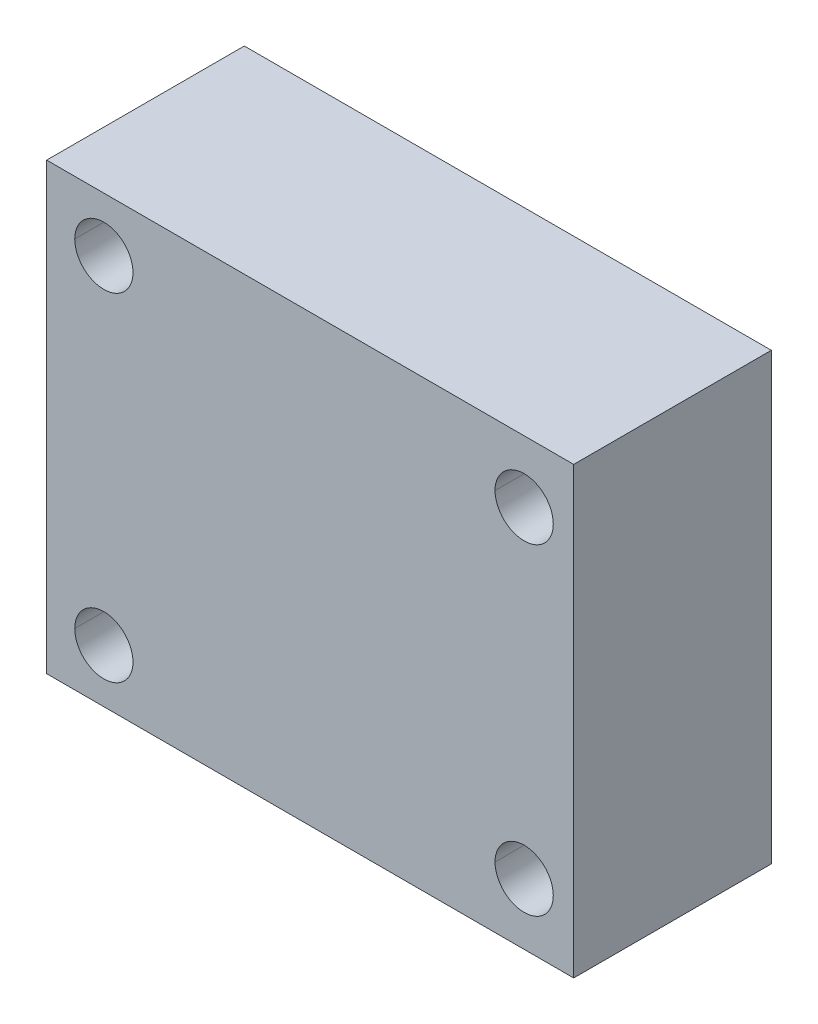
ISO-10303-21;
HEADER;
FILE_DESCRIPTION(('STEP AP214'),'2;1');
FILE_NAME('part.step','',(''),(''),'','','');
FILE_SCHEMA(('AUTOMOTIVE_DESIGN { 1 0 10303 214 1 1 1 1 }'));
ENDSEC;
DATA;
#1=APPLICATION_CONTEXT('core data for automotive mechanical design processes');
#2=APPLICATION_PROTOCOL_DEFINITION('international standard','automotive_design',2000,#1);
#3=PRODUCT_CONTEXT('',#1,'mechanical');
#4=PRODUCT('Part','Part','',(#3));
#5=PRODUCT_RELATED_PRODUCT_CATEGORY('part','',(#4));
#6=PRODUCT_DEFINITION_FORMATION('','',#4);
#7=PRODUCT_DEFINITION_CONTEXT('part definition',#1,'design');
#8=PRODUCT_DEFINITION('design','',#6,#7);
#9=PRODUCT_DEFINITION_SHAPE('','',#8);
#10=(LENGTH_UNIT() NAMED_UNIT(*) SI_UNIT(.MILLI.,.METRE.));
#11=(NAMED_UNIT(*) PLANE_ANGLE_UNIT() SI_UNIT($,.RADIAN.));
#12=(NAMED_UNIT(*) SI_UNIT($,.STERADIAN.) SOLID_ANGLE_UNIT());
#13=UNCERTAINTY_MEASURE_WITH_UNIT(LENGTH_MEASURE(1.E-05),#10,'distance_accuracy_value','');
#14=(GEOMETRIC_REPRESENTATION_CONTEXT(3) GLOBAL_UNCERTAINTY_ASSIGNED_CONTEXT((#13)) GLOBAL_UNIT_ASSIGNED_CONTEXT((#10,
#11,#12)) REPRESENTATION_CONTEXT('',''));
#15=CARTESIAN_POINT('',(0.,0.,0.));
#16=DIRECTION('',(0.,0.,1.));
#17=DIRECTION('',(1.,0.,0.));
#18=AXIS2_PLACEMENT_3D('',#15,#16,#17);
#19=CARTESIAN_POINT('',(111.96564613414,331.44206,19.05));
#20=DIRECTION('',(0.,-1.,0.));
#21=DIRECTION('',(0.,0.,-1.));
#22=AXIS2_PLACEMENT_3D('',#19,#20,#21);
#23=PLANE('',#22);
#24=DIRECTION('',(-1.,0.,0.));
#25=VECTOR('',#24,1.);
#26=CARTESIAN_POINT('',(111.96564613414,331.44206,0.));
#27=LINE('',#26,#25);
#28=CARTESIAN_POINT('',(111.96564613414,331.44206,0.));
#29=VERTEX_POINT('',#28);
#30=CARTESIAN_POINT('',(61.165646134144,331.44206,0.));
#31=VERTEX_POINT('',#30);
#32=EDGE_CURVE('E11',#29,#31,#27,.T.);
#33=ORIENTED_EDGE('',*,*,#32,.T.);
#34=DIRECTION('',(0.,0.,-1.));
#35=VECTOR('',#34,1.);
#36=CARTESIAN_POINT('',(61.165646134144,331.44206,19.05));
#37=LINE('',#36,#35);
#38=CARTESIAN_POINT('',(61.165646134144,331.44206,19.05));
#39=VERTEX_POINT('',#38);
#40=EDGE_CURVE('E25',#39,#31,#37,.T.);
#41=ORIENTED_EDGE('',*,*,#40,.F.);
#42=DIRECTION('',(-1.,0.,0.));
#43=VECTOR('',#42,1.);
#44=CARTESIAN_POINT('',(111.96564613414,331.44206,19.05));
#45=LINE('',#44,#43);
#46=CARTESIAN_POINT('',(111.96564613414,331.44206,19.05));
#47=VERTEX_POINT('',#46);
#48=EDGE_CURVE('E240',#47,#39,#45,.T.);
#49=ORIENTED_EDGE('',*,*,#48,.F.);
#50=DIRECTION('',(0.,0.,-1.));
#51=VECTOR('',#50,1.);
#52=CARTESIAN_POINT('',(111.96564613414,331.44206,19.05));
#53=LINE('',#52,#51);
#54=EDGE_CURVE('E236',#47,#29,#53,.T.);
#55=ORIENTED_EDGE('',*,*,#54,.T.);
#56=EDGE_LOOP('',(#33,#41,#49,#55));
#57=FACE_BOUND('',#56,.T.);
#58=ADVANCED_FACE('F17',(#57),#23,.F.);
#59=CARTESIAN_POINT('',(111.96564613414,288.56686,19.05));
#60=DIRECTION('',(-1.,0.,0.));
#61=DIRECTION('',(0.,0.,1.));
#62=AXIS2_PLACEMENT_3D('',#59,#60,#61);
#63=PLANE('',#62);
#64=DIRECTION('',(0.,1.,0.));
#65=VECTOR('',#64,1.);
#66=CARTESIAN_POINT('',(111.96564613414,288.56686,0.));
#67=LINE('',#66,#65);
#68=CARTESIAN_POINT('',(111.96564613414,288.56686,0.));
#69=VERTEX_POINT('',#68);
#70=EDGE_CURVE('E231',#69,#29,#67,.T.);
#71=ORIENTED_EDGE('',*,*,#70,.T.);
#72=ORIENTED_EDGE('',*,*,#54,.F.);
#73=DIRECTION('',(0.,1.,0.));
#74=VECTOR('',#73,1.);
#75=CARTESIAN_POINT('',(111.96564613414,288.56686,19.05));
#76=LINE('',#75,#74);
#77=CARTESIAN_POINT('',(111.96564613414,288.56686,19.05));
#78=VERTEX_POINT('',#77);
#79=EDGE_CURVE('E226',#78,#47,#76,.T.);
#80=ORIENTED_EDGE('',*,*,#79,.F.);
#81=DIRECTION('',(0.,0.,-1.));
#82=VECTOR('',#81,1.);
#83=CARTESIAN_POINT('',(111.96564613414,288.56686,19.05));
#84=LINE('',#83,#82);
#85=EDGE_CURVE('E222',#78,#69,#84,.T.);
#86=ORIENTED_EDGE('',*,*,#85,.T.);
#87=EDGE_LOOP('',(#71,#72,#80,#86));
#88=FACE_BOUND('',#87,.T.);
#89=ADVANCED_FACE('F263',(#88),#63,.F.);
#90=CARTESIAN_POINT('',(61.165646134144,288.56686,19.05));
#91=DIRECTION('',(0.,1.,0.));
#92=DIRECTION('',(0.,0.,1.));
#93=AXIS2_PLACEMENT_3D('',#90,#91,#92);
#94=PLANE('',#93);
#95=DIRECTION('',(1.,0.,0.));
#96=VECTOR('',#95,1.);
#97=CARTESIAN_POINT('',(61.165646134144,288.56686,0.));
#98=LINE('',#97,#96);
#99=CARTESIAN_POINT('',(61.165646134144,288.56686,0.));
#100=VERTEX_POINT('',#99);
#101=EDGE_CURVE('E217',#100,#69,#98,.T.);
#102=ORIENTED_EDGE('',*,*,#101,.T.);
#103=ORIENTED_EDGE('',*,*,#85,.F.);
#104=DIRECTION('',(1.,0.,0.));
#105=VECTOR('',#104,1.);
#106=CARTESIAN_POINT('',(61.165646134144,288.56686,19.05));
#107=LINE('',#106,#105);
#108=CARTESIAN_POINT('',(61.165646134144,288.56686,19.05));
#109=VERTEX_POINT('',#108);
#110=EDGE_CURVE('E212',#109,#78,#107,.T.);
#111=ORIENTED_EDGE('',*,*,#110,.F.);
#112=DIRECTION('',(0.,0.,-1.));
#113=VECTOR('',#112,1.);
#114=CARTESIAN_POINT('',(61.165646134144,288.56686,19.05));
#115=LINE('',#114,#113);
#116=EDGE_CURVE('E208',#109,#100,#115,.T.);
#117=ORIENTED_EDGE('',*,*,#116,.T.);
#118=EDGE_LOOP('',(#102,#103,#111,#117));
#119=FACE_BOUND('',#118,.T.);
#120=ADVANCED_FACE('F258',(#119),#94,.F.);
#121=CARTESIAN_POINT('',(61.165646134144,331.44206,19.05));
#122=DIRECTION('',(1.,0.,0.));
#123=DIRECTION('',(0.,0.,-1.));
#124=AXIS2_PLACEMENT_3D('',#121,#122,#123);
#125=PLANE('',#124);
#126=DIRECTION('',(0.,-1.,0.));
#127=VECTOR('',#126,1.);
#128=CARTESIAN_POINT('',(61.165646134144,331.44206,0.));
#129=LINE('',#128,#127);
#130=EDGE_CURVE('E203',#31,#100,#129,.T.);
#131=ORIENTED_EDGE('',*,*,#130,.T.);
#132=ORIENTED_EDGE('',*,*,#116,.F.);
#133=DIRECTION('',(0.,-1.,0.));
#134=VECTOR('',#133,1.);
#135=CARTESIAN_POINT('',(61.165646134144,331.44206,19.05));
#136=LINE('',#135,#134);
#137=EDGE_CURVE('E198',#39,#109,#136,.T.);
#138=ORIENTED_EDGE('',*,*,#137,.F.);
#139=ORIENTED_EDGE('',*,*,#40,.T.);
#140=EDGE_LOOP('',(#131,#132,#138,#139));
#141=FACE_BOUND('',#140,.T.);
#142=ADVANCED_FACE('F251',(#141),#125,.F.);
#143=CARTESIAN_POINT('',(0.,0.,19.05));
#144=DIRECTION('',(0.,0.,1.));
#145=DIRECTION('',(1.,0.,0.));
#146=AXIS2_PLACEMENT_3D('',#143,#144,#145);
#147=PLANE('',#146);
#148=CARTESIAN_POINT('',(66.677446134144,293.69766,19.05));
#149=DIRECTION('',(0.,0.,1.));
#150=DIRECTION('',(1.,0.,0.));
#151=AXIS2_PLACEMENT_3D('',#148,#149,#150);
#152=CIRCLE('',#151,2.8067);
#153=CARTESIAN_POINT('',(69.484146134144,293.69766,19.05));
#154=VERTEX_POINT('',#153);
#155=CARTESIAN_POINT('',(63.870746134144,293.69766,19.05));
#156=VERTEX_POINT('',#155);
#157=EDGE_CURVE('E193',#154,#156,#152,.T.);
#158=ORIENTED_EDGE('',*,*,#157,.F.);
#159=CARTESIAN_POINT('',(66.677446134144,293.69766,19.05));
#160=DIRECTION('',(0.,0.,1.));
#161=DIRECTION('',(1.,0.,0.));
#162=AXIS2_PLACEMENT_3D('',#159,#160,#161);
#163=CIRCLE('',#162,2.8067);
#164=EDGE_CURVE('E188',#156,#154,#163,.T.);
#165=ORIENTED_EDGE('',*,*,#164,.F.);
#166=EDGE_LOOP('',(#158,#165));
#167=FACE_BOUND('',#166,.T.);
#168=CARTESIAN_POINT('',(66.677446134144,326.20966,19.05));
#169=DIRECTION('',(0.,0.,1.));
#170=DIRECTION('',(1.,0.,0.));
#171=AXIS2_PLACEMENT_3D('',#168,#169,#170);
#172=CIRCLE('',#171,2.8067);
#173=CARTESIAN_POINT('',(69.484146134144,326.20966,19.05));
#174=VERTEX_POINT('',#173);
#175=CARTESIAN_POINT('',(63.870746134144,326.20966,19.05));
#176=VERTEX_POINT('',#175);
#177=EDGE_CURVE('E183',#174,#176,#172,.T.);
#178=ORIENTED_EDGE('',*,*,#177,.F.);
#179=CARTESIAN_POINT('',(66.677446134144,326.20966,19.05));
#180=DIRECTION('',(0.,0.,1.));
#181=DIRECTION('',(1.,0.,0.));
#182=AXIS2_PLACEMENT_3D('',#179,#180,#181);
#183=CIRCLE('',#182,2.8067);
#184=EDGE_CURVE('E178',#176,#174,#183,.T.);
#185=ORIENTED_EDGE('',*,*,#184,.F.);
#186=EDGE_LOOP('',(#178,#185));
#187=FACE_BOUND('',#186,.T.);
#188=CARTESIAN_POINT('',(107.19044613414,294.45966,19.05));
#189=DIRECTION('',(0.,0.,1.));
#190=DIRECTION('',(1.,0.,0.));
#191=AXIS2_PLACEMENT_3D('',#188,#189,#190);
#192=CIRCLE('',#191,2.8067);
#193=CARTESIAN_POINT('',(109.99714613414,294.45966,19.05));
#194=VERTEX_POINT('',#193);
#195=CARTESIAN_POINT('',(104.38374613414,294.45966,19.05));
#196=VERTEX_POINT('',#195);
#197=EDGE_CURVE('E174',#194,#196,#192,.T.);
#198=ORIENTED_EDGE('',*,*,#197,.F.);
#199=CARTESIAN_POINT('',(107.19044613414,294.45966,19.05));
#200=DIRECTION('',(0.,0.,1.));
#201=DIRECTION('',(1.,0.,0.));
#202=AXIS2_PLACEMENT_3D('',#199,#200,#201);
#203=CIRCLE('',#202,2.8067);
#204=EDGE_CURVE('E115',#196,#194,#203,.T.);
#205=ORIENTED_EDGE('',*,*,#204,.F.);
#206=EDGE_LOOP('',(#198,#205));
#207=FACE_BOUND('',#206,.T.);
#208=CARTESIAN_POINT('',(107.19044613414,325.47306,19.05));
#209=DIRECTION('',(0.,0.,1.));
#210=DIRECTION('',(1.,0.,0.));
#211=AXIS2_PLACEMENT_3D('',#208,#209,#210);
#212=CIRCLE('',#211,2.8067);
#213=CARTESIAN_POINT('',(109.99714613414,325.47306,19.05));
#214=VERTEX_POINT('',#213);
#215=CARTESIAN_POINT('',(104.38374613414,325.47306,19.05));
#216=VERTEX_POINT('',#215);
#217=EDGE_CURVE('E166',#214,#216,#212,.T.);
#218=ORIENTED_EDGE('',*,*,#217,.F.);
#219=CARTESIAN_POINT('',(107.19044613414,325.47306,19.05));
#220=DIRECTION('',(0.,0.,1.));
#221=DIRECTION('',(1.,0.,0.));
#222=AXIS2_PLACEMENT_3D('',#219,#220,#221);
#223=CIRCLE('',#222,2.8067);
#224=EDGE_CURVE('E161',#216,#214,#223,.T.);
#225=ORIENTED_EDGE('',*,*,#224,.F.);
#226=EDGE_LOOP('',(#218,#225));
#227=FACE_BOUND('',#226,.T.);
#228=ORIENTED_EDGE('',*,*,#48,.T.);
#229=ORIENTED_EDGE('',*,*,#137,.T.);
#230=ORIENTED_EDGE('',*,*,#110,.T.);
#231=ORIENTED_EDGE('',*,*,#79,.T.);
#232=EDGE_LOOP('',(#228,#229,#230,#231));
#233=FACE_BOUND('',#232,.T.);
#234=ADVANCED_FACE('F260',(#167,#187,#207,#227,#233),#147,.T.);
#235=CARTESIAN_POINT('',(107.19044613414,325.47306,19.05));
#236=DIRECTION('',(0.,0.,1.));
#237=DIRECTION('',(0.,1.,0.));
#238=AXIS2_PLACEMENT_3D('',#235,#236,#237);
#239=CYLINDRICAL_SURFACE('',#238,2.8067);
#240=CARTESIAN_POINT('',(107.19044613414,325.47306,0.));
#241=DIRECTION('',(0.,0.,1.));
#242=DIRECTION('',(1.,0.,0.));
#243=AXIS2_PLACEMENT_3D('',#240,#241,#242);
#244=CIRCLE('',#243,2.8067);
#245=CARTESIAN_POINT('',(104.38374613414,325.47306,0.));
#246=VERTEX_POINT('',#245);
#247=CARTESIAN_POINT('',(109.99714613414,325.47306,0.));
#248=VERTEX_POINT('',#247);
#249=EDGE_CURVE('E156',#246,#248,#244,.T.);
#250=ORIENTED_EDGE('',*,*,#249,.F.);
#251=DIRECTION('',(0.,0.,1.));
#252=VECTOR('',#251,1.);
#253=CARTESIAN_POINT('',(104.38374613414,325.47306,0.));
#254=LINE('',#253,#252);
#255=EDGE_CURVE('E151',#246,#216,#254,.T.);
#256=ORIENTED_EDGE('',*,*,#255,.T.);
#257=ORIENTED_EDGE('',*,*,#224,.T.);
#258=DIRECTION('',(0.,0.,1.));
#259=VECTOR('',#258,1.);
#260=CARTESIAN_POINT('',(109.99714613414,325.47306,0.));
#261=LINE('',#260,#259);
#262=EDGE_CURVE('E146',#248,#214,#261,.T.);
#263=ORIENTED_EDGE('',*,*,#262,.F.);
#264=EDGE_LOOP('',(#250,#256,#257,#263));
#265=FACE_BOUND('',#264,.T.);
#266=ADVANCED_FACE('F276',(#265),#239,.F.);
#267=CARTESIAN_POINT('',(107.19044613414,325.47306,19.05));
#268=DIRECTION('',(0.,0.,1.));
#269=DIRECTION('',(0.,-1.,0.));
#270=AXIS2_PLACEMENT_3D('',#267,#268,#269);
#271=CYLINDRICAL_SURFACE('',#270,2.8067);
#272=ORIENTED_EDGE('',*,*,#217,.T.);
#273=ORIENTED_EDGE('',*,*,#255,.F.);
#274=CARTESIAN_POINT('',(107.19044613414,325.47306,0.));
#275=DIRECTION('',(0.,0.,1.));
#276=DIRECTION('',(1.,0.,0.));
#277=AXIS2_PLACEMENT_3D('',#274,#275,#276);
#278=CIRCLE('',#277,2.8067);
#279=EDGE_CURVE('E141',#248,#246,#278,.T.);
#280=ORIENTED_EDGE('',*,*,#279,.F.);
#281=ORIENTED_EDGE('',*,*,#262,.T.);
#282=EDGE_LOOP('',(#272,#273,#280,#281));
#283=FACE_BOUND('',#282,.T.);
#284=ADVANCED_FACE('F280',(#283),#271,.F.);
#285=CARTESIAN_POINT('',(0.,0.,0.));
#286=DIRECTION('',(0.,0.,1.));
#287=DIRECTION('',(1.,0.,0.));
#288=AXIS2_PLACEMENT_3D('',#285,#286,#287);
#289=PLANE('',#288);
#290=CARTESIAN_POINT('',(66.677446134144,293.69766,0.));
#291=DIRECTION('',(0.,0.,1.));
#292=DIRECTION('',(1.,0.,0.));
#293=AXIS2_PLACEMENT_3D('',#290,#291,#292);
#294=CIRCLE('',#293,2.8067);
#295=CARTESIAN_POINT('',(69.484146134144,293.69766,0.));
#296=VERTEX_POINT('',#295);
#297=CARTESIAN_POINT('',(63.870746134144,293.69766,0.));
#298=VERTEX_POINT('',#297);
#299=EDGE_CURVE('E137',#296,#298,#294,.T.);
#300=ORIENTED_EDGE('',*,*,#299,.T.);
#301=CARTESIAN_POINT('',(66.677446134144,293.69766,0.));
#302=DIRECTION('',(0.,0.,1.));
#303=DIRECTION('',(1.,0.,0.));
#304=AXIS2_PLACEMENT_3D('',#301,#302,#303);
#305=CIRCLE('',#304,2.8067);
#306=EDGE_CURVE('E133',#298,#296,#305,.T.);
#307=ORIENTED_EDGE('',*,*,#306,.T.);
#308=EDGE_LOOP('',(#300,#307));
#309=FACE_BOUND('',#308,.T.);
#310=CARTESIAN_POINT('',(66.677446134144,326.20966,0.));
#311=DIRECTION('',(0.,0.,1.));
#312=DIRECTION('',(1.,0.,0.));
#313=AXIS2_PLACEMENT_3D('',#310,#311,#312);
#314=CIRCLE('',#313,2.8067);
#315=CARTESIAN_POINT('',(69.484146134144,326.20966,0.));
#316=VERTEX_POINT('',#315);
#317=CARTESIAN_POINT('',(63.870746134144,326.20966,0.));
#318=VERTEX_POINT('',#317);
#319=EDGE_CURVE('E123',#316,#318,#314,.T.);
#320=ORIENTED_EDGE('',*,*,#319,.T.);
#321=CARTESIAN_POINT('',(66.677446134144,326.20966,0.));
#322=DIRECTION('',(0.,0.,1.));
#323=DIRECTION('',(1.,0.,0.));
#324=AXIS2_PLACEMENT_3D('',#321,#322,#323);
#325=CIRCLE('',#324,2.8067);
#326=EDGE_CURVE('E121',#318,#316,#325,.T.);
#327=ORIENTED_EDGE('',*,*,#326,.T.);
#328=EDGE_LOOP('',(#320,#327));
#329=FACE_BOUND('',#328,.T.);
#330=CARTESIAN_POINT('',(107.19044613414,294.45966,0.));
#331=DIRECTION('',(0.,0.,1.));
#332=DIRECTION('',(1.,0.,0.));
#333=AXIS2_PLACEMENT_3D('',#330,#331,#332);
#334=CIRCLE('',#333,2.8067);
#335=CARTESIAN_POINT('',(109.99714613414,294.45966,0.));
#336=VERTEX_POINT('',#335);
#337=CARTESIAN_POINT('',(104.38374613414,294.45966,0.));
#338=VERTEX_POINT('',#337);
#339=EDGE_CURVE('E105',#336,#338,#334,.T.);
#340=ORIENTED_EDGE('',*,*,#339,.T.);
#341=CARTESIAN_POINT('',(107.19044613414,294.45966,0.));
#342=DIRECTION('',(0.,0.,1.));
#343=DIRECTION('',(1.,0.,0.));
#344=AXIS2_PLACEMENT_3D('',#341,#342,#343);
#345=CIRCLE('',#344,2.8067);
#346=EDGE_CURVE('E100',#338,#336,#345,.T.);
#347=ORIENTED_EDGE('',*,*,#346,.T.);
#348=EDGE_LOOP('',(#340,#347));
#349=FACE_BOUND('',#348,.T.);
#350=ORIENTED_EDGE('',*,*,#279,.T.);
#351=ORIENTED_EDGE('',*,*,#249,.T.);
#352=EDGE_LOOP('',(#350,#351));
#353=FACE_BOUND('',#352,.T.);
#354=ORIENTED_EDGE('',*,*,#32,.F.);
#355=ORIENTED_EDGE('',*,*,#70,.F.);
#356=ORIENTED_EDGE('',*,*,#101,.F.);
#357=ORIENTED_EDGE('',*,*,#130,.F.);
#358=EDGE_LOOP('',(#354,#355,#356,#357));
#359=FACE_BOUND('',#358,.T.);
#360=ADVANCED_FACE('F102',(#309,#329,#349,#353,#359),#289,.F.);
#361=CARTESIAN_POINT('',(107.19044613414,294.45966,19.05));
#362=DIRECTION('',(0.,0.,1.));
#363=DIRECTION('',(0.,1.,0.));
#364=AXIS2_PLACEMENT_3D('',#361,#362,#363);
#365=CYLINDRICAL_SURFACE('',#364,2.8067);
#366=ORIENTED_EDGE('',*,*,#346,.F.);
#367=DIRECTION('',(0.,0.,1.));
#368=VECTOR('',#367,1.);
#369=CARTESIAN_POINT('',(104.38374613414,294.45966,0.));
#370=LINE('',#369,#368);
#371=EDGE_CURVE('E109',#338,#196,#370,.T.);
#372=ORIENTED_EDGE('',*,*,#371,.T.);
#373=ORIENTED_EDGE('',*,*,#204,.T.);
#374=DIRECTION('',(0.,0.,1.));
#375=VECTOR('',#374,1.);
#376=CARTESIAN_POINT('',(109.99714613414,294.45966,0.));
#377=LINE('',#376,#375);
#378=EDGE_CURVE('E113',#336,#194,#377,.T.);
#379=ORIENTED_EDGE('',*,*,#378,.F.);
#380=EDGE_LOOP('',(#366,#372,#373,#379));
#381=FACE_BOUND('',#380,.T.);
#382=ADVANCED_FACE('F114',(#381),#365,.F.);
#383=CARTESIAN_POINT('',(107.19044613414,294.45966,19.05));
#384=DIRECTION('',(0.,0.,1.));
#385=DIRECTION('',(0.,-1.,0.));
#386=AXIS2_PLACEMENT_3D('',#383,#384,#385);
#387=CYLINDRICAL_SURFACE('',#386,2.8067);
#388=ORIENTED_EDGE('',*,*,#197,.T.);
#389=ORIENTED_EDGE('',*,*,#371,.F.);
#390=ORIENTED_EDGE('',*,*,#339,.F.);
#391=ORIENTED_EDGE('',*,*,#378,.T.);
#392=EDGE_LOOP('',(#388,#389,#390,#391));
#393=FACE_BOUND('',#392,.T.);
#394=ADVANCED_FACE('F120',(#393),#387,.F.);
#395=CARTESIAN_POINT('',(66.677446134144,326.20966,19.05));
#396=DIRECTION('',(0.,0.,1.));
#397=DIRECTION('',(0.,1.,0.));
#398=AXIS2_PLACEMENT_3D('',#395,#396,#397);
#399=CYLINDRICAL_SURFACE('',#398,2.8067);
#400=ORIENTED_EDGE('',*,*,#326,.F.);
#401=DIRECTION('',(0.,0.,1.));
#402=VECTOR('',#401,1.);
#403=CARTESIAN_POINT('',(63.870746134144,326.20966,0.));
#404=LINE('',#403,#402);
#405=EDGE_CURVE('E118',#318,#176,#404,.T.);
#406=ORIENTED_EDGE('',*,*,#405,.T.);
#407=ORIENTED_EDGE('',*,*,#184,.T.);
#408=DIRECTION('',(0.,0.,1.));
#409=VECTOR('',#408,1.);
#410=CARTESIAN_POINT('',(69.484146134144,326.20966,0.));
#411=LINE('',#410,#409);
#412=EDGE_CURVE('E318',#316,#174,#411,.T.);
#413=ORIENTED_EDGE('',*,*,#412,.F.);
#414=EDGE_LOOP('',(#400,#406,#407,#413));
#415=FACE_BOUND('',#414,.T.);
#416=ADVANCED_FACE('F292',(#415),#399,.F.);
#417=CARTESIAN_POINT('',(66.677446134144,326.20966,19.05));
#418=DIRECTION('',(0.,0.,1.));
#419=DIRECTION('',(0.,-1.,0.));
#420=AXIS2_PLACEMENT_3D('',#417,#418,#419);
#421=CYLINDRICAL_SURFACE('',#420,2.8067);
#422=ORIENTED_EDGE('',*,*,#177,.T.);
#423=ORIENTED_EDGE('',*,*,#405,.F.);
#424=ORIENTED_EDGE('',*,*,#319,.F.);
#425=ORIENTED_EDGE('',*,*,#412,.T.);
#426=EDGE_LOOP('',(#422,#423,#424,#425));
#427=FACE_BOUND('',#426,.T.);
#428=ADVANCED_FACE('F295',(#427),#421,.F.);
#429=CARTESIAN_POINT('',(66.677446134144,293.69766,19.05));
#430=DIRECTION('',(0.,0.,1.));
#431=DIRECTION('',(0.,1.,0.));
#432=AXIS2_PLACEMENT_3D('',#429,#430,#431);
#433=CYLINDRICAL_SURFACE('',#432,2.8067);
#434=ORIENTED_EDGE('',*,*,#306,.F.);
#435=DIRECTION('',(0.,0.,1.));
#436=VECTOR('',#435,1.);
#437=CARTESIAN_POINT('',(63.870746134144,293.69766,0.));
#438=LINE('',#437,#436);
#439=EDGE_CURVE('E313',#298,#156,#438,.T.);
#440=ORIENTED_EDGE('',*,*,#439,.T.);
#441=ORIENTED_EDGE('',*,*,#164,.T.);
#442=DIRECTION('',(0.,0.,1.));
#443=VECTOR('',#442,1.);
#444=CARTESIAN_POINT('',(69.484146134144,293.69766,0.));
#445=LINE('',#444,#443);
#446=EDGE_CURVE('E315',#296,#154,#445,.T.);
#447=ORIENTED_EDGE('',*,*,#446,.F.);
#448=EDGE_LOOP('',(#434,#440,#441,#447));
#449=FACE_BOUND('',#448,.T.);
#450=ADVANCED_FACE('F299',(#449),#433,.F.);
#451=CARTESIAN_POINT('',(66.677446134144,293.69766,19.05));
#452=DIRECTION('',(0.,0.,1.));
#453=DIRECTION('',(0.,-1.,0.));
#454=AXIS2_PLACEMENT_3D('',#451,#452,#453);
#455=CYLINDRICAL_SURFACE('',#454,2.8067);
#456=ORIENTED_EDGE('',*,*,#157,.T.);
#457=ORIENTED_EDGE('',*,*,#439,.F.);
#458=ORIENTED_EDGE('',*,*,#299,.F.);
#459=ORIENTED_EDGE('',*,*,#446,.T.);
#460=EDGE_LOOP('',(#456,#457,#458,#459));
#461=FACE_BOUND('',#460,.T.);
#462=ADVANCED_FACE('F303',(#461),#455,.F.);
#463=CLOSED_SHELL('',(#58,#89,#120,#142,#234,#266,#284,#360,#382,#394,#416,#428,#450,#462));
#464=MANIFOLD_SOLID_BREP('B1',#463);
#465=ADVANCED_BREP_SHAPE_REPRESENTATION('',(#18,#464),#14);
#466=SHAPE_DEFINITION_REPRESENTATION(#9,#465);
ENDSEC;
END-ISO-10303-21;
